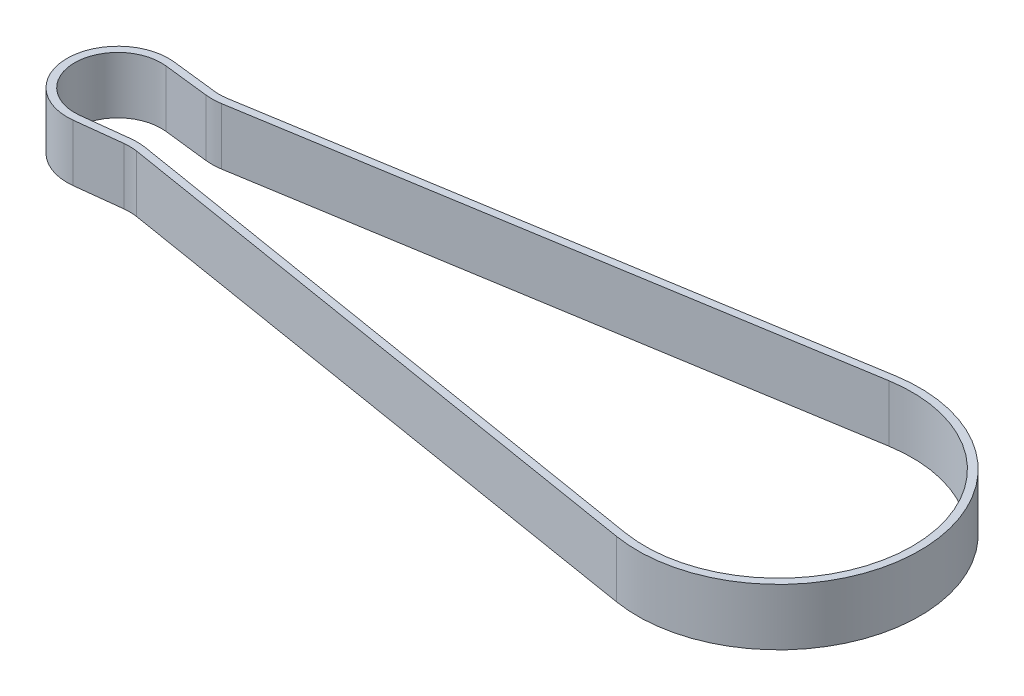
ISO-10303-21;
HEADER;
FILE_DESCRIPTION(('STEP AP214'),'2;1');
FILE_NAME('part.step','',(''),(''),'','','');
FILE_SCHEMA(('AUTOMOTIVE_DESIGN { 1 0 10303 214 1 1 1 1 }'));
ENDSEC;
DATA;
#1=APPLICATION_CONTEXT('core data for automotive mechanical design processes');
#2=APPLICATION_PROTOCOL_DEFINITION('international standard','automotive_design',2000,#1);
#3=PRODUCT_CONTEXT('',#1,'mechanical');
#4=PRODUCT('Part','Part','',(#3));
#5=PRODUCT_RELATED_PRODUCT_CATEGORY('part','',(#4));
#6=PRODUCT_DEFINITION_FORMATION('','',#4);
#7=PRODUCT_DEFINITION_CONTEXT('part definition',#1,'design');
#8=PRODUCT_DEFINITION('design','',#6,#7);
#9=PRODUCT_DEFINITION_SHAPE('','',#8);
#10=(LENGTH_UNIT() NAMED_UNIT(*) SI_UNIT(.MILLI.,.METRE.));
#11=(NAMED_UNIT(*) PLANE_ANGLE_UNIT() SI_UNIT($,.RADIAN.));
#12=(NAMED_UNIT(*) SI_UNIT($,.STERADIAN.) SOLID_ANGLE_UNIT());
#13=UNCERTAINTY_MEASURE_WITH_UNIT(LENGTH_MEASURE(1.E-05),#10,'distance_accuracy_value','');
#14=(GEOMETRIC_REPRESENTATION_CONTEXT(3) GLOBAL_UNCERTAINTY_ASSIGNED_CONTEXT((#13)) GLOBAL_UNIT_ASSIGNED_CONTEXT((#10,
#11,#12)) REPRESENTATION_CONTEXT('',''));
#15=CARTESIAN_POINT('',(0.,0.,0.));
#16=DIRECTION('',(0.,0.,1.));
#17=DIRECTION('',(1.,0.,0.));
#18=AXIS2_PLACEMENT_3D('',#15,#16,#17);
#19=CARTESIAN_POINT('',(0.,-3.,0.));
#20=DIRECTION('',(0.,1.,0.));
#21=DIRECTION('',(0.,0.,1.));
#22=AXIS2_PLACEMENT_3D('',#19,#20,#21);
#23=CYLINDRICAL_SURFACE('',#22,5.375);
#24=DIRECTION('',(0.,1.,0.));
#25=VECTOR('',#24,1.);
#26=CARTESIAN_POINT('',(0.617779055512381,-3.,5.3393795555823));
#27=LINE('',#26,#25);
#28=CARTESIAN_POINT('',(0.617779055512381,-3.,5.3393795555823));
#29=VERTEX_POINT('',#28);
#30=CARTESIAN_POINT('',(0.617779055512381,3.,5.3393795555823));
#31=VERTEX_POINT('',#30);
#32=EDGE_CURVE('E136',#29,#31,#27,.T.);
#33=ORIENTED_EDGE('',*,*,#32,.T.);
#34=CARTESIAN_POINT('',(0.,3.,0.));
#35=DIRECTION('',(0.,1.,0.));
#36=DIRECTION('',(1.,0.,0.));
#37=AXIS2_PLACEMENT_3D('',#34,#35,#36);
#38=CIRCLE('',#37,5.375);
#39=CARTESIAN_POINT('',(0.617779055512381,3.,-5.3393795555823));
#40=VERTEX_POINT('',#39);
#41=EDGE_CURVE('E289',#40,#31,#38,.T.);
#42=ORIENTED_EDGE('',*,*,#41,.F.);
#43=DIRECTION('',(0.,1.,0.));
#44=VECTOR('',#43,1.);
#45=CARTESIAN_POINT('',(0.617779055512381,-3.,-5.3393795555823));
#46=LINE('',#45,#44);
#47=CARTESIAN_POINT('',(0.617779055512381,-3.,-5.3393795555823));
#48=VERTEX_POINT('',#47);
#49=EDGE_CURVE('E12',#48,#40,#46,.T.);
#50=ORIENTED_EDGE('',*,*,#49,.F.);
#51=CARTESIAN_POINT('',(0.,-3.,0.));
#52=DIRECTION('',(0.,1.,0.));
#53=DIRECTION('',(1.,0.,0.));
#54=AXIS2_PLACEMENT_3D('',#51,#52,#53);
#55=CIRCLE('',#54,5.375);
#56=EDGE_CURVE('E332',#48,#29,#55,.T.);
#57=ORIENTED_EDGE('',*,*,#56,.T.);
#58=EDGE_LOOP('',(#33,#42,#50,#57));
#59=FACE_BOUND('',#58,.T.);
#60=ADVANCED_FACE('F133',(#59),#23,.T.);
#61=CARTESIAN_POINT('',(0.617779055512381,-3.,-5.3393795555823));
#62=DIRECTION('',(0.114935638234861,0.,-0.993372940573451));
#63=DIRECTION('',(-0.993372940573451,0.,-0.114935638234861));
#64=AXIS2_PLACEMENT_3D('',#61,#62,#63);
#65=PLANE('',#64);
#66=ORIENTED_EDGE('',*,*,#49,.T.);
#67=DIRECTION('',(-0.993372940573451,0.,-0.114935638234861));
#68=VECTOR('',#67,1.);
#69=CARTESIAN_POINT('',(0.617779055512381,3.,-5.3393795555823));
#70=LINE('',#69,#68);
#71=CARTESIAN_POINT('',(5.42532180882562,3.,-4.78313529713244));
#72=VERTEX_POINT('',#71);
#73=EDGE_CURVE('E310',#72,#40,#70,.T.);
#74=ORIENTED_EDGE('',*,*,#73,.F.);
#75=DIRECTION('',(0.,1.,0.));
#76=VECTOR('',#75,1.);
#77=CARTESIAN_POINT('',(5.42532180882562,-3.,-4.78313529713244));
#78=LINE('',#77,#76);
#79=CARTESIAN_POINT('',(5.42532180882562,-3.,-4.78313529713244));
#80=VERTEX_POINT('',#79);
#81=EDGE_CURVE('E141',#80,#72,#78,.T.);
#82=ORIENTED_EDGE('',*,*,#81,.F.);
#83=DIRECTION('',(-0.993372940573451,0.,-0.114935638234861));
#84=VECTOR('',#83,1.);
#85=CARTESIAN_POINT('',(0.617779055512381,-3.,-5.3393795555823));
#86=LINE('',#85,#84);
#87=EDGE_CURVE('E363',#80,#48,#86,.T.);
#88=ORIENTED_EDGE('',*,*,#87,.T.);
#89=EDGE_LOOP('',(#66,#74,#82,#88));
#90=FACE_BOUND('',#89,.T.);
#91=ADVANCED_FACE('F384',(#90),#65,.T.);
#92=CARTESIAN_POINT('',(5.99999999999994,-3.,-9.75000000000031));
#93=DIRECTION('',(0.,1.,0.));
#94=DIRECTION('',(0.,0.,1.));
#95=AXIS2_PLACEMENT_3D('',#92,#93,#94);
#96=CYLINDRICAL_SURFACE('',#95,5.00000000000061);
#97=ORIENTED_EDGE('',*,*,#81,.T.);
#98=CARTESIAN_POINT('',(5.99999999999994,3.,-9.75000000000031));
#99=DIRECTION('',(0.,1.,0.));
#100=DIRECTION('',(1.,0.,0.));
#101=AXIS2_PLACEMENT_3D('',#98,#99,#100);
#102=CIRCLE('',#101,5.00000000000061);
#103=CARTESIAN_POINT('',(6.80614708076724,3.,-4.81541522677203));
#104=VERTEX_POINT('',#103);
#105=EDGE_CURVE('E307',#104,#72,#102,.F.);
#106=ORIENTED_EDGE('',*,*,#105,.F.);
#107=DIRECTION('',(0.,1.,0.));
#108=VECTOR('',#107,1.);
#109=CARTESIAN_POINT('',(6.80614708076724,-3.,-4.81541522677203));
#110=LINE('',#109,#108);
#111=CARTESIAN_POINT('',(6.80614708076724,-3.,-4.81541522677203));
#112=VERTEX_POINT('',#111);
#113=EDGE_CURVE('E367',#112,#104,#110,.T.);
#114=ORIENTED_EDGE('',*,*,#113,.F.);
#115=CARTESIAN_POINT('',(5.99999999999994,-3.,-9.75000000000031));
#116=DIRECTION('',(0.,1.,0.));
#117=DIRECTION('',(1.,0.,0.));
#118=AXIS2_PLACEMENT_3D('',#115,#116,#117);
#119=CIRCLE('',#118,5.00000000000061);
#120=EDGE_CURVE('E360',#112,#80,#119,.F.);
#121=ORIENTED_EDGE('',*,*,#120,.T.);
#122=EDGE_LOOP('',(#97,#106,#114,#121));
#123=FACE_BOUND('',#122,.T.);
#124=ADVANCED_FACE('F405',(#123),#96,.F.);
#125=CARTESIAN_POINT('',(67.4936509639095,-3.,-14.7297355480846));
#126=DIRECTION('',(-0.161229416153464,0.,-0.986916954645533));
#127=DIRECTION('',(-0.986916954645533,0.,0.161229416153464));
#128=AXIS2_PLACEMENT_3D('',#125,#126,#127);
#129=PLANE('',#128);
#130=ORIENTED_EDGE('',*,*,#113,.T.);
#131=DIRECTION('',(-0.986916954645533,0.,0.161229416153464));
#132=VECTOR('',#131,1.);
#133=CARTESIAN_POINT('',(67.4936509639095,3.,-14.7297355480846));
#134=LINE('',#133,#132);
#135=CARTESIAN_POINT('',(67.4936509639095,3.,-14.7297355480846));
#136=VERTEX_POINT('',#135);
#137=EDGE_CURVE('E304',#136,#104,#134,.T.);
#138=ORIENTED_EDGE('',*,*,#137,.F.);
#139=DIRECTION('',(0.,1.,0.));
#140=VECTOR('',#139,1.);
#141=CARTESIAN_POINT('',(67.4936509639095,-3.,-14.7297355480846));
#142=LINE('',#141,#140);
#143=CARTESIAN_POINT('',(67.4936509639095,-3.,-14.7297355480846));
#144=VERTEX_POINT('',#143);
#145=EDGE_CURVE('E369',#144,#136,#142,.T.);
#146=ORIENTED_EDGE('',*,*,#145,.F.);
#147=DIRECTION('',(-0.986916954645533,0.,0.161229416153464));
#148=VECTOR('',#147,1.);
#149=CARTESIAN_POINT('',(67.4936509639095,-3.,-14.7297355480846));
#150=LINE('',#149,#148);
#151=EDGE_CURVE('E357',#144,#112,#150,.T.);
#152=ORIENTED_EDGE('',*,*,#151,.T.);
#153=EDGE_LOOP('',(#130,#138,#146,#152));
#154=FACE_BOUND('',#153,.T.);
#155=ADVANCED_FACE('F402',(#154),#129,.T.);
#156=CARTESIAN_POINT('',(69.9,-3.,0.));
#157=DIRECTION('',(0.,1.,0.));
#158=DIRECTION('',(0.,0.,1.));
#159=AXIS2_PLACEMENT_3D('',#156,#157,#158);
#160=CYLINDRICAL_SURFACE('',#159,14.925);
#161=ORIENTED_EDGE('',*,*,#145,.T.);
#162=CARTESIAN_POINT('',(69.9,3.,0.));
#163=DIRECTION('',(0.,1.,0.));
#164=DIRECTION('',(1.,0.,0.));
#165=AXIS2_PLACEMENT_3D('',#162,#163,#164);
#166=CIRCLE('',#165,14.925);
#167=CARTESIAN_POINT('',(67.4936509639095,3.,14.7297355480846));
#168=VERTEX_POINT('',#167);
#169=EDGE_CURVE('E301',#168,#136,#166,.T.);
#170=ORIENTED_EDGE('',*,*,#169,.F.);
#171=DIRECTION('',(0.,1.,0.));
#172=VECTOR('',#171,1.);
#173=CARTESIAN_POINT('',(67.4936509639095,-3.,14.7297355480846));
#174=LINE('',#173,#172);
#175=CARTESIAN_POINT('',(67.4936509639095,-3.,14.7297355480846));
#176=VERTEX_POINT('',#175);
#177=EDGE_CURVE('E371',#176,#168,#174,.T.);
#178=ORIENTED_EDGE('',*,*,#177,.F.);
#179=CARTESIAN_POINT('',(69.9,-3.,0.));
#180=DIRECTION('',(0.,1.,0.));
#181=DIRECTION('',(1.,0.,0.));
#182=AXIS2_PLACEMENT_3D('',#179,#180,#181);
#183=CIRCLE('',#182,14.925);
#184=EDGE_CURVE('E354',#176,#144,#183,.T.);
#185=ORIENTED_EDGE('',*,*,#184,.T.);
#186=EDGE_LOOP('',(#161,#170,#178,#185));
#187=FACE_BOUND('',#186,.T.);
#188=ADVANCED_FACE('F400',(#187),#160,.T.);
#189=CARTESIAN_POINT('',(67.4936509639095,-3.,14.7297355480846));
#190=DIRECTION('',(-0.161229416153464,0.,0.986916954645533));
#191=DIRECTION('',(0.986916954645533,0.,0.161229416153464));
#192=AXIS2_PLACEMENT_3D('',#189,#190,#191);
#193=PLANE('',#192);
#194=ORIENTED_EDGE('',*,*,#177,.T.);
#195=DIRECTION('',(0.986916954645533,0.,0.161229416153464));
#196=VECTOR('',#195,1.);
#197=CARTESIAN_POINT('',(67.4936509639095,3.,14.7297355480846));
#198=LINE('',#197,#196);
#199=CARTESIAN_POINT('',(6.80614708076727,3.,4.81541522677203));
#200=VERTEX_POINT('',#199);
#201=EDGE_CURVE('E298',#200,#168,#198,.T.);
#202=ORIENTED_EDGE('',*,*,#201,.F.);
#203=DIRECTION('',(0.,1.,0.));
#204=VECTOR('',#203,1.);
#205=CARTESIAN_POINT('',(6.80614708076727,-3.,4.81541522677203));
#206=LINE('',#205,#204);
#207=CARTESIAN_POINT('',(6.80614708076727,-3.,4.81541522677203));
#208=VERTEX_POINT('',#207);
#209=EDGE_CURVE('E373',#208,#200,#206,.T.);
#210=ORIENTED_EDGE('',*,*,#209,.F.);
#211=DIRECTION('',(0.986916954645533,0.,0.161229416153464));
#212=VECTOR('',#211,1.);
#213=CARTESIAN_POINT('',(67.4936509639095,-3.,14.7297355480846));
#214=LINE('',#213,#212);
#215=EDGE_CURVE('E351',#208,#176,#214,.T.);
#216=ORIENTED_EDGE('',*,*,#215,.T.);
#217=EDGE_LOOP('',(#194,#202,#210,#216));
#218=FACE_BOUND('',#217,.T.);
#219=ADVANCED_FACE('F398',(#218),#193,.T.);
#220=CARTESIAN_POINT('',(5.99999999999994,-3.,9.75000000000031));
#221=DIRECTION('',(0.,1.,0.));
#222=DIRECTION('',(0.,0.,1.));
#223=AXIS2_PLACEMENT_3D('',#220,#221,#222);
#224=CYLINDRICAL_SURFACE('',#223,5.00000000000061);
#225=ORIENTED_EDGE('',*,*,#209,.T.);
#226=CARTESIAN_POINT('',(5.99999999999994,3.,9.75000000000031));
#227=DIRECTION('',(0.,1.,0.));
#228=DIRECTION('',(1.,0.,0.));
#229=AXIS2_PLACEMENT_3D('',#226,#227,#228);
#230=CIRCLE('',#229,5.00000000000061);
#231=CARTESIAN_POINT('',(5.42532180882563,3.,4.78313529713244));
#232=VERTEX_POINT('',#231);
#233=EDGE_CURVE('E295',#232,#200,#230,.F.);
#234=ORIENTED_EDGE('',*,*,#233,.F.);
#235=DIRECTION('',(0.,1.,0.));
#236=VECTOR('',#235,1.);
#237=CARTESIAN_POINT('',(5.42532180882563,-3.,4.78313529713244));
#238=LINE('',#237,#236);
#239=CARTESIAN_POINT('',(5.42532180882563,-3.,4.78313529713244));
#240=VERTEX_POINT('',#239);
#241=EDGE_CURVE('E374',#240,#232,#238,.T.);
#242=ORIENTED_EDGE('',*,*,#241,.F.);
#243=CARTESIAN_POINT('',(5.99999999999994,-3.,9.75000000000031));
#244=DIRECTION('',(0.,1.,0.));
#245=DIRECTION('',(1.,0.,0.));
#246=AXIS2_PLACEMENT_3D('',#243,#244,#245);
#247=CIRCLE('',#246,5.00000000000061);
#248=EDGE_CURVE('E348',#240,#208,#247,.F.);
#249=ORIENTED_EDGE('',*,*,#248,.T.);
#250=EDGE_LOOP('',(#225,#234,#242,#249));
#251=FACE_BOUND('',#250,.T.);
#252=ADVANCED_FACE('F394',(#251),#224,.F.);
#253=CARTESIAN_POINT('',(0.617779055512381,-3.,5.3393795555823));
#254=DIRECTION('',(0.114935638234861,0.,0.993372940573451));
#255=DIRECTION('',(0.993372940573451,0.,-0.114935638234861));
#256=AXIS2_PLACEMENT_3D('',#253,#254,#255);
#257=PLANE('',#256);
#258=ORIENTED_EDGE('',*,*,#241,.T.);
#259=DIRECTION('',(0.993372940573451,0.,-0.114935638234861));
#260=VECTOR('',#259,1.);
#261=CARTESIAN_POINT('',(0.617779055512381,3.,5.3393795555823));
#262=LINE('',#261,#260);
#263=EDGE_CURVE('E292',#31,#232,#262,.T.);
#264=ORIENTED_EDGE('',*,*,#263,.F.);
#265=ORIENTED_EDGE('',*,*,#32,.F.);
#266=DIRECTION('',(0.993372940573451,0.,-0.114935638234861));
#267=VECTOR('',#266,1.);
#268=CARTESIAN_POINT('',(0.617779055512381,-3.,5.3393795555823));
#269=LINE('',#268,#267);
#270=EDGE_CURVE('E345',#29,#240,#269,.T.);
#271=ORIENTED_EDGE('',*,*,#270,.T.);
#272=EDGE_LOOP('',(#258,#264,#265,#271));
#273=FACE_BOUND('',#272,.T.);
#274=ADVANCED_FACE('F378',(#273),#257,.T.);
#275=CARTESIAN_POINT('',(0.,-3.,0.));
#276=DIRECTION('',(0.,1.,0.));
#277=DIRECTION('',(0.,0.,1.));
#278=AXIS2_PLACEMENT_3D('',#275,#276,#277);
#279=PLANE('',#278);
#280=DIRECTION('',(-0.993372940573451,0.,-0.114935638234861));
#281=VECTOR('',#280,1.);
#282=CARTESIAN_POINT('',(0.525830544924492,-3.,-4.54468120312354));
#283=LINE('',#282,#281);
#284=CARTESIAN_POINT('',(5.33337329823774,-3.,-3.98843694467368));
#285=VERTEX_POINT('',#284);
#286=CARTESIAN_POINT('',(0.525830544924492,-3.,-4.54468120312354));
#287=VERTEX_POINT('',#286);
#288=EDGE_CURVE('E258',#285,#287,#283,.T.);
#289=ORIENTED_EDGE('',*,*,#288,.T.);
#290=CARTESIAN_POINT('',(0.,-3.,0.));
#291=DIRECTION('',(0.,1.,0.));
#292=DIRECTION('',(1.,0.,0.));
#293=AXIS2_PLACEMENT_3D('',#290,#291,#292);
#294=CIRCLE('',#293,4.575);
#295=CARTESIAN_POINT('',(0.525830544924492,-3.,4.54468120312354));
#296=VERTEX_POINT('',#295);
#297=EDGE_CURVE('E313',#287,#296,#294,.T.);
#298=ORIENTED_EDGE('',*,*,#297,.T.);
#299=DIRECTION('',(0.993372940573451,0.,-0.114935638234861));
#300=VECTOR('',#299,1.);
#301=CARTESIAN_POINT('',(0.525830544924492,-3.,4.54468120312354));
#302=LINE('',#301,#300);
#303=CARTESIAN_POINT('',(5.33337329823774,-3.,3.98843694467367));
#304=VERTEX_POINT('',#303);
#305=EDGE_CURVE('E253',#296,#304,#302,.T.);
#306=ORIENTED_EDGE('',*,*,#305,.T.);
#307=CARTESIAN_POINT('',(5.99999999999994,-3.,9.75000000000031));
#308=DIRECTION('',(0.,1.,0.));
#309=DIRECTION('',(1.,0.,0.));
#310=AXIS2_PLACEMENT_3D('',#307,#308,#309);
#311=CIRCLE('',#310,5.80000000000061);
#312=CARTESIAN_POINT('',(6.93513061369002,-3.,4.0258816630556));
#313=VERTEX_POINT('',#312);
#314=EDGE_CURVE('E149',#304,#313,#311,.F.);
#315=ORIENTED_EDGE('',*,*,#314,.T.);
#316=DIRECTION('',(0.986916954645533,0.,0.161229416153464));
#317=VECTOR('',#316,1.);
#318=CARTESIAN_POINT('',(67.6226344968323,-3.,13.9402019843681));
#319=LINE('',#318,#317);
#320=CARTESIAN_POINT('',(67.6226344968323,-3.,13.9402019843681));
#321=VERTEX_POINT('',#320);
#322=EDGE_CURVE('E317',#313,#321,#319,.T.);
#323=ORIENTED_EDGE('',*,*,#322,.T.);
#324=CARTESIAN_POINT('',(69.9,-3.,0.));
#325=DIRECTION('',(0.,1.,0.));
#326=DIRECTION('',(1.,0.,0.));
#327=AXIS2_PLACEMENT_3D('',#324,#325,#326);
#328=CIRCLE('',#327,14.125);
#329=CARTESIAN_POINT('',(67.6226344968323,-3.,-13.9402019843681));
#330=VERTEX_POINT('',#329);
#331=EDGE_CURVE('E320',#321,#330,#328,.T.);
#332=ORIENTED_EDGE('',*,*,#331,.T.);
#333=DIRECTION('',(-0.986916954645533,0.,0.161229416153464));
#334=VECTOR('',#333,1.);
#335=CARTESIAN_POINT('',(67.6226344968323,-3.,-13.9402019843681));
#336=LINE('',#335,#334);
#337=CARTESIAN_POINT('',(6.93513061369001,-3.,-4.0258816630556));
#338=VERTEX_POINT('',#337);
#339=EDGE_CURVE('E323',#330,#338,#336,.T.);
#340=ORIENTED_EDGE('',*,*,#339,.T.);
#341=CARTESIAN_POINT('',(5.99999999999994,-3.,-9.75000000000031));
#342=DIRECTION('',(0.,1.,0.));
#343=DIRECTION('',(1.,0.,0.));
#344=AXIS2_PLACEMENT_3D('',#341,#342,#343);
#345=CIRCLE('',#344,5.80000000000061);
#346=EDGE_CURVE('E326',#338,#285,#345,.F.);
#347=ORIENTED_EDGE('',*,*,#346,.T.);
#348=EDGE_LOOP('',(#289,#298,#306,#315,#323,#332,#340,#347));
#349=FACE_BOUND('',#348,.T.);
#350=ORIENTED_EDGE('',*,*,#56,.F.);
#351=ORIENTED_EDGE('',*,*,#87,.F.);
#352=ORIENTED_EDGE('',*,*,#120,.F.);
#353=ORIENTED_EDGE('',*,*,#151,.F.);
#354=ORIENTED_EDGE('',*,*,#184,.F.);
#355=ORIENTED_EDGE('',*,*,#215,.F.);
#356=ORIENTED_EDGE('',*,*,#248,.F.);
#357=ORIENTED_EDGE('',*,*,#270,.F.);
#358=EDGE_LOOP('',(#350,#351,#352,#353,#354,#355,#356,#357));
#359=FACE_BOUND('',#358,.T.);
#360=ADVANCED_FACE('F388',(#349,#359),#279,.F.);
#361=CARTESIAN_POINT('',(0.,-3.,0.));
#362=DIRECTION('',(0.,1.,0.));
#363=DIRECTION('',(0.,0.,1.));
#364=AXIS2_PLACEMENT_3D('',#361,#362,#363);
#365=CYLINDRICAL_SURFACE('',#364,4.575);
#366=DIRECTION('',(0.,1.,0.));
#367=VECTOR('',#366,1.);
#368=CARTESIAN_POINT('',(0.525830544924492,-3.,-4.54468120312354));
#369=LINE('',#368,#367);
#370=CARTESIAN_POINT('',(0.525830544924492,3.,-4.54468120312354));
#371=VERTEX_POINT('',#370);
#372=EDGE_CURVE('E263',#287,#371,#369,.T.);
#373=ORIENTED_EDGE('',*,*,#372,.T.);
#374=CARTESIAN_POINT('',(0.,3.,0.));
#375=DIRECTION('',(0.,1.,0.));
#376=DIRECTION('',(1.,0.,0.));
#377=AXIS2_PLACEMENT_3D('',#374,#375,#376);
#378=CIRCLE('',#377,4.575);
#379=CARTESIAN_POINT('',(0.525830544924492,3.,4.54468120312354));
#380=VERTEX_POINT('',#379);
#381=EDGE_CURVE('E261',#371,#380,#378,.T.);
#382=ORIENTED_EDGE('',*,*,#381,.T.);
#383=DIRECTION('',(0.,1.,0.));
#384=VECTOR('',#383,1.);
#385=CARTESIAN_POINT('',(0.525830544924492,-3.,4.54468120312354));
#386=LINE('',#385,#384);
#387=EDGE_CURVE('E246',#296,#380,#386,.T.);
#388=ORIENTED_EDGE('',*,*,#387,.F.);
#389=ORIENTED_EDGE('',*,*,#297,.F.);
#390=EDGE_LOOP('',(#373,#382,#388,#389));
#391=FACE_BOUND('',#390,.T.);
#392=ADVANCED_FACE('F262',(#391),#365,.F.);
#393=CARTESIAN_POINT('',(0.525830544924492,-3.,-4.54468120312354));
#394=DIRECTION('',(0.114935638234861,0.,-0.993372940573451));
#395=DIRECTION('',(-0.993372940573451,0.,-0.114935638234861));
#396=AXIS2_PLACEMENT_3D('',#393,#394,#395);
#397=PLANE('',#396);
#398=DIRECTION('',(0.,1.,0.));
#399=VECTOR('',#398,1.);
#400=CARTESIAN_POINT('',(5.33337329823774,-3.,-3.98843694467368));
#401=LINE('',#400,#399);
#402=CARTESIAN_POINT('',(5.33337329823774,3.,-3.98843694467367));
#403=VERTEX_POINT('',#402);
#404=EDGE_CURVE('E333',#285,#403,#401,.T.);
#405=ORIENTED_EDGE('',*,*,#404,.T.);
#406=DIRECTION('',(-0.993372940573451,0.,-0.114935638234861));
#407=VECTOR('',#406,1.);
#408=CARTESIAN_POINT('',(0.525830544924492,3.,-4.54468120312354));
#409=LINE('',#408,#407);
#410=EDGE_CURVE('E287',#403,#371,#409,.T.);
#411=ORIENTED_EDGE('',*,*,#410,.T.);
#412=ORIENTED_EDGE('',*,*,#372,.F.);
#413=ORIENTED_EDGE('',*,*,#288,.F.);
#414=EDGE_LOOP('',(#405,#411,#412,#413));
#415=FACE_BOUND('',#414,.T.);
#416=ADVANCED_FACE('F480',(#415),#397,.F.);
#417=CARTESIAN_POINT('',(5.99999999999994,-3.,-9.75000000000031));
#418=DIRECTION('',(0.,1.,0.));
#419=DIRECTION('',(0.,0.,1.));
#420=AXIS2_PLACEMENT_3D('',#417,#418,#419);
#421=CYLINDRICAL_SURFACE('',#420,5.80000000000061);
#422=DIRECTION('',(0.,1.,0.));
#423=VECTOR('',#422,1.);
#424=CARTESIAN_POINT('',(6.93513061369001,-3.,-4.0258816630556));
#425=LINE('',#424,#423);
#426=CARTESIAN_POINT('',(6.93513061369001,3.,-4.0258816630556));
#427=VERTEX_POINT('',#426);
#428=EDGE_CURVE('E335',#338,#427,#425,.T.);
#429=ORIENTED_EDGE('',*,*,#428,.T.);
#430=CARTESIAN_POINT('',(5.99999999999994,3.,-9.75000000000031));
#431=DIRECTION('',(0.,1.,0.));
#432=DIRECTION('',(1.,0.,0.));
#433=AXIS2_PLACEMENT_3D('',#430,#431,#432);
#434=CIRCLE('',#433,5.80000000000061);
#435=EDGE_CURVE('E284',#427,#403,#434,.F.);
#436=ORIENTED_EDGE('',*,*,#435,.T.);
#437=ORIENTED_EDGE('',*,*,#404,.F.);
#438=ORIENTED_EDGE('',*,*,#346,.F.);
#439=EDGE_LOOP('',(#429,#436,#437,#438));
#440=FACE_BOUND('',#439,.T.);
#441=ADVANCED_FACE('F489',(#440),#421,.T.);
#442=CARTESIAN_POINT('',(67.6226344968323,-3.,-13.9402019843681));
#443=DIRECTION('',(-0.161229416153464,0.,-0.986916954645533));
#444=DIRECTION('',(-0.986916954645533,0.,0.161229416153464));
#445=AXIS2_PLACEMENT_3D('',#442,#443,#444);
#446=PLANE('',#445);
#447=DIRECTION('',(0.,1.,0.));
#448=VECTOR('',#447,1.);
#449=CARTESIAN_POINT('',(67.6226344968323,-3.,-13.9402019843681));
#450=LINE('',#449,#448);
#451=CARTESIAN_POINT('',(67.6226344968323,3.,-13.9402019843681));
#452=VERTEX_POINT('',#451);
#453=EDGE_CURVE('E337',#330,#452,#450,.T.);
#454=ORIENTED_EDGE('',*,*,#453,.T.);
#455=DIRECTION('',(-0.986916954645533,0.,0.161229416153464));
#456=VECTOR('',#455,1.);
#457=CARTESIAN_POINT('',(67.6226344968323,3.,-13.9402019843681));
#458=LINE('',#457,#456);
#459=EDGE_CURVE('E281',#452,#427,#458,.T.);
#460=ORIENTED_EDGE('',*,*,#459,.T.);
#461=ORIENTED_EDGE('',*,*,#428,.F.);
#462=ORIENTED_EDGE('',*,*,#339,.F.);
#463=EDGE_LOOP('',(#454,#460,#461,#462));
#464=FACE_BOUND('',#463,.T.);
#465=ADVANCED_FACE('F499',(#464),#446,.F.);
#466=CARTESIAN_POINT('',(69.9,-3.,0.));
#467=DIRECTION('',(0.,1.,0.));
#468=DIRECTION('',(0.,0.,1.));
#469=AXIS2_PLACEMENT_3D('',#466,#467,#468);
#470=CYLINDRICAL_SURFACE('',#469,14.125);
#471=DIRECTION('',(0.,1.,0.));
#472=VECTOR('',#471,1.);
#473=CARTESIAN_POINT('',(67.6226344968323,-3.,13.9402019843681));
#474=LINE('',#473,#472);
#475=CARTESIAN_POINT('',(67.6226344968323,3.,13.9402019843681));
#476=VERTEX_POINT('',#475);
#477=EDGE_CURVE('E339',#321,#476,#474,.T.);
#478=ORIENTED_EDGE('',*,*,#477,.T.);
#479=CARTESIAN_POINT('',(69.9,3.,0.));
#480=DIRECTION('',(0.,1.,0.));
#481=DIRECTION('',(1.,0.,0.));
#482=AXIS2_PLACEMENT_3D('',#479,#480,#481);
#483=CIRCLE('',#482,14.125);
#484=EDGE_CURVE('E278',#476,#452,#483,.T.);
#485=ORIENTED_EDGE('',*,*,#484,.T.);
#486=ORIENTED_EDGE('',*,*,#453,.F.);
#487=ORIENTED_EDGE('',*,*,#331,.F.);
#488=EDGE_LOOP('',(#478,#485,#486,#487));
#489=FACE_BOUND('',#488,.T.);
#490=ADVANCED_FACE('F509',(#489),#470,.F.);
#491=CARTESIAN_POINT('',(67.6226344968323,-3.,13.9402019843681));
#492=DIRECTION('',(-0.161229416153464,0.,0.986916954645533));
#493=DIRECTION('',(0.986916954645533,0.,0.161229416153464));
#494=AXIS2_PLACEMENT_3D('',#491,#492,#493);
#495=PLANE('',#494);
#496=DIRECTION('',(0.,1.,0.));
#497=VECTOR('',#496,1.);
#498=CARTESIAN_POINT('',(6.93513061369002,-3.,4.0258816630556));
#499=LINE('',#498,#497);
#500=CARTESIAN_POINT('',(6.93513061369002,3.,4.0258816630556));
#501=VERTEX_POINT('',#500);
#502=EDGE_CURVE('E341',#313,#501,#499,.T.);
#503=ORIENTED_EDGE('',*,*,#502,.T.);
#504=DIRECTION('',(0.986916954645533,0.,0.161229416153464));
#505=VECTOR('',#504,1.);
#506=CARTESIAN_POINT('',(67.6226344968323,3.,13.9402019843681));
#507=LINE('',#506,#505);
#508=EDGE_CURVE('E273',#501,#476,#507,.T.);
#509=ORIENTED_EDGE('',*,*,#508,.T.);
#510=ORIENTED_EDGE('',*,*,#477,.F.);
#511=ORIENTED_EDGE('',*,*,#322,.F.);
#512=EDGE_LOOP('',(#503,#509,#510,#511));
#513=FACE_BOUND('',#512,.T.);
#514=ADVANCED_FACE('F519',(#513),#495,.F.);
#515=CARTESIAN_POINT('',(5.99999999999994,-3.,9.75000000000031));
#516=DIRECTION('',(0.,1.,0.));
#517=DIRECTION('',(0.,0.,1.));
#518=AXIS2_PLACEMENT_3D('',#515,#516,#517);
#519=CYLINDRICAL_SURFACE('',#518,5.80000000000061);
#520=DIRECTION('',(0.,1.,0.));
#521=VECTOR('',#520,1.);
#522=CARTESIAN_POINT('',(5.33337329823774,-3.,3.98843694467367));
#523=LINE('',#522,#521);
#524=CARTESIAN_POINT('',(5.33337329823774,3.,3.98843694467367));
#525=VERTEX_POINT('',#524);
#526=EDGE_CURVE('E257',#304,#525,#523,.T.);
#527=ORIENTED_EDGE('',*,*,#526,.T.);
#528=CARTESIAN_POINT('',(5.99999999999994,3.,9.75000000000031));
#529=DIRECTION('',(0.,1.,0.));
#530=DIRECTION('',(1.,0.,0.));
#531=AXIS2_PLACEMENT_3D('',#528,#529,#530);
#532=CIRCLE('',#531,5.80000000000061);
#533=EDGE_CURVE('E271',#525,#501,#532,.F.);
#534=ORIENTED_EDGE('',*,*,#533,.T.);
#535=ORIENTED_EDGE('',*,*,#502,.F.);
#536=ORIENTED_EDGE('',*,*,#314,.F.);
#537=EDGE_LOOP('',(#527,#534,#535,#536));
#538=FACE_BOUND('',#537,.T.);
#539=ADVANCED_FACE('F529',(#538),#519,.T.);
#540=CARTESIAN_POINT('',(0.525830544924492,-3.,4.54468120312354));
#541=DIRECTION('',(0.114935638234861,0.,0.993372940573451));
#542=DIRECTION('',(0.993372940573451,0.,-0.114935638234861));
#543=AXIS2_PLACEMENT_3D('',#540,#541,#542);
#544=PLANE('',#543);
#545=ORIENTED_EDGE('',*,*,#387,.T.);
#546=DIRECTION('',(0.993372940573451,0.,-0.114935638234861));
#547=VECTOR('',#546,1.);
#548=CARTESIAN_POINT('',(0.525830544924492,3.,4.54468120312354));
#549=LINE('',#548,#547);
#550=EDGE_CURVE('E250',#380,#525,#549,.T.);
#551=ORIENTED_EDGE('',*,*,#550,.T.);
#552=ORIENTED_EDGE('',*,*,#526,.F.);
#553=ORIENTED_EDGE('',*,*,#305,.F.);
#554=EDGE_LOOP('',(#545,#551,#552,#553));
#555=FACE_BOUND('',#554,.T.);
#556=ADVANCED_FACE('F248',(#555),#544,.F.);
#557=CARTESIAN_POINT('',(0.,3.,0.));
#558=DIRECTION('',(0.,1.,0.));
#559=DIRECTION('',(0.,0.,1.));
#560=AXIS2_PLACEMENT_3D('',#557,#558,#559);
#561=PLANE('',#560);
#562=ORIENTED_EDGE('',*,*,#41,.T.);
#563=ORIENTED_EDGE('',*,*,#263,.T.);
#564=ORIENTED_EDGE('',*,*,#233,.T.);
#565=ORIENTED_EDGE('',*,*,#201,.T.);
#566=ORIENTED_EDGE('',*,*,#169,.T.);
#567=ORIENTED_EDGE('',*,*,#137,.T.);
#568=ORIENTED_EDGE('',*,*,#105,.T.);
#569=ORIENTED_EDGE('',*,*,#73,.T.);
#570=EDGE_LOOP('',(#562,#563,#564,#565,#566,#567,#568,#569));
#571=FACE_BOUND('',#570,.T.);
#572=ORIENTED_EDGE('',*,*,#550,.F.);
#573=ORIENTED_EDGE('',*,*,#381,.F.);
#574=ORIENTED_EDGE('',*,*,#410,.F.);
#575=ORIENTED_EDGE('',*,*,#435,.F.);
#576=ORIENTED_EDGE('',*,*,#459,.F.);
#577=ORIENTED_EDGE('',*,*,#484,.F.);
#578=ORIENTED_EDGE('',*,*,#508,.F.);
#579=ORIENTED_EDGE('',*,*,#533,.F.);
#580=EDGE_LOOP('',(#572,#573,#574,#575,#576,#577,#578,#579));
#581=FACE_BOUND('',#580,.T.);
#582=ADVANCED_FACE('F268',(#571,#581),#561,.T.);
#583=CLOSED_SHELL('',(#60,#91,#124,#155,#188,#219,#252,#274,#360,#392,#416,#441,#465,#490,#514,
#539,#556,#582));
#584=MANIFOLD_SOLID_BREP('B2',#583);
#585=ADVANCED_BREP_SHAPE_REPRESENTATION('',(#18,#584),#14);
#586=SHAPE_DEFINITION_REPRESENTATION(#9,#585);
ENDSEC;
END-ISO-10303-21;
